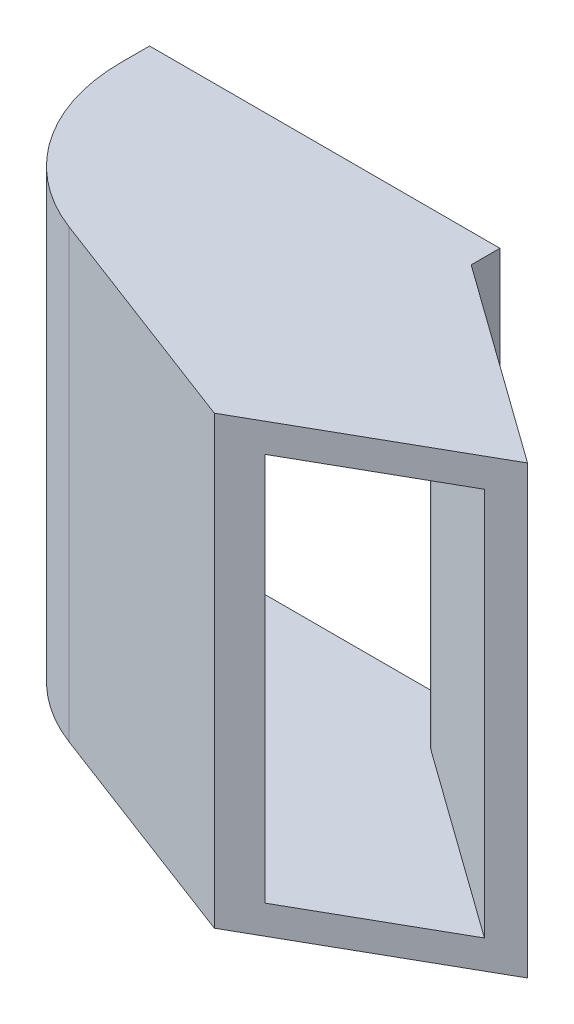
ISO-10303-21;
HEADER;
FILE_DESCRIPTION(('STEP AP214'),'2;1');
FILE_NAME('part.step','',(''),(''),'','','');
FILE_SCHEMA(('AUTOMOTIVE_DESIGN { 1 0 10303 214 1 1 1 1 }'));
ENDSEC;
DATA;
#1=APPLICATION_CONTEXT('core data for automotive mechanical design processes');
#2=APPLICATION_PROTOCOL_DEFINITION('international standard','automotive_design',2000,#1);
#3=PRODUCT_CONTEXT('',#1,'mechanical');
#4=PRODUCT('Part','Part','',(#3));
#5=PRODUCT_RELATED_PRODUCT_CATEGORY('part','',(#4));
#6=PRODUCT_DEFINITION_FORMATION('','',#4);
#7=PRODUCT_DEFINITION_CONTEXT('part definition',#1,'design');
#8=PRODUCT_DEFINITION('design','',#6,#7);
#9=PRODUCT_DEFINITION_SHAPE('','',#8);
#10=(LENGTH_UNIT() NAMED_UNIT(*) SI_UNIT(.MILLI.,.METRE.));
#11=(NAMED_UNIT(*) PLANE_ANGLE_UNIT() SI_UNIT($,.RADIAN.));
#12=(NAMED_UNIT(*) SI_UNIT($,.STERADIAN.) SOLID_ANGLE_UNIT());
#13=UNCERTAINTY_MEASURE_WITH_UNIT(LENGTH_MEASURE(1.E-05),#10,'distance_accuracy_value','');
#14=(GEOMETRIC_REPRESENTATION_CONTEXT(3) GLOBAL_UNCERTAINTY_ASSIGNED_CONTEXT((#13)) GLOBAL_UNIT_ASSIGNED_CONTEXT((#10,
#11,#12)) REPRESENTATION_CONTEXT('',''));
#15=CARTESIAN_POINT('',(0.,0.,0.));
#16=DIRECTION('',(0.,0.,1.));
#17=DIRECTION('',(1.,0.,0.));
#18=AXIS2_PLACEMENT_3D('',#15,#16,#17);
#19=CARTESIAN_POINT('',(16.8,-23.3,0.));
#20=DIRECTION('',(0.58318555545216,0.,-0.81233897352765));
#21=DIRECTION('',(-0.81233897352765,0.,-0.58318555545216));
#22=AXIS2_PLACEMENT_3D('',#19,#20,#21);
#23=PLANE('',#22);
#24=DIRECTION('',(-0.812338973527649,0.,-0.58318555545216));
#25=VECTOR('',#24,1.);
#26=CARTESIAN_POINT('',(16.8,0.,0.));
#27=LINE('',#26,#25);
#28=CARTESIAN_POINT('',(27.2341044944077,0.,7.4907387476343));
#29=VERTEX_POINT('',#28);
#30=CARTESIAN_POINT('',(16.8,0.,0.));
#31=VERTEX_POINT('',#30);
#32=EDGE_CURVE('E210',#29,#31,#27,.T.);
#33=ORIENTED_EDGE('',*,*,#32,.F.);
#34=DIRECTION('',(0.,1.,0.));
#35=VECTOR('',#34,1.);
#36=CARTESIAN_POINT('',(27.2341044944077,-23.3,7.4907387476343));
#37=LINE('',#36,#35);
#38=CARTESIAN_POINT('',(27.2341044944077,-23.3,7.4907387476343));
#39=VERTEX_POINT('',#38);
#40=EDGE_CURVE('E12',#39,#29,#37,.T.);
#41=ORIENTED_EDGE('',*,*,#40,.F.);
#42=DIRECTION('',(-0.812338973527649,0.,-0.58318555545216));
#43=VECTOR('',#42,1.);
#44=CARTESIAN_POINT('',(16.8,-23.3,0.));
#45=LINE('',#44,#43);
#46=CARTESIAN_POINT('',(16.8,-23.3,0.));
#47=VERTEX_POINT('',#46);
#48=EDGE_CURVE('E232',#39,#47,#45,.T.);
#49=ORIENTED_EDGE('',*,*,#48,.T.);
#50=DIRECTION('',(0.,1.,0.));
#51=VECTOR('',#50,1.);
#52=CARTESIAN_POINT('',(16.8,-23.3,0.));
#53=LINE('',#52,#51);
#54=EDGE_CURVE('E38',#47,#31,#53,.T.);
#55=ORIENTED_EDGE('',*,*,#54,.T.);
#56=EDGE_LOOP('',(#33,#41,#49,#55));
#57=FACE_BOUND('',#56,.T.);
#58=ADVANCED_FACE('F35',(#57),#23,.T.);
#59=CARTESIAN_POINT('',(27.2341044944077,-23.3,7.4907387476343));
#60=DIRECTION('',(0.493917611492973,0.,0.869508707867308));
#61=DIRECTION('',(0.869508707867308,0.,-0.493917611492973));
#62=AXIS2_PLACEMENT_3D('',#59,#60,#61);
#63=PLANE('',#62);
#64=DIRECTION('',(0.869508707867308,0.,-0.493917611492973));
#65=VECTOR('',#64,1.);
#66=CARTESIAN_POINT('',(18.4935547125013,-1.5,12.4557395950709));
#67=LINE('',#66,#65);
#68=CARTESIAN_POINT('',(18.4935547125013,-1.5,12.4557395950709));
#69=VERTEX_POINT('',#68);
#70=CARTESIAN_POINT('',(25.7981871136928,-1.5,8.30640036961335));
#71=VERTEX_POINT('',#70);
#72=EDGE_CURVE('E217',#69,#71,#67,.T.);
#73=ORIENTED_EDGE('',*,*,#72,.T.);
#74=DIRECTION('',(0.,1.,0.));
#75=VECTOR('',#74,1.);
#76=CARTESIAN_POINT('',(25.7981871136928,-51.9477208031166,8.30640036961335));
#77=LINE('',#76,#75);
#78=CARTESIAN_POINT('',(25.7981871136928,-21.8,8.30640036961334));
#79=VERTEX_POINT('',#78);
#80=EDGE_CURVE('E224',#79,#71,#77,.T.);
#81=ORIENTED_EDGE('',*,*,#80,.F.);
#82=DIRECTION('',(-0.869508707867308,0.,0.493917611492974));
#83=VECTOR('',#82,1.);
#84=CARTESIAN_POINT('',(18.4935547125013,-21.8,12.4557395950709));
#85=LINE('',#84,#83);
#86=CARTESIAN_POINT('',(18.4935547125013,-21.8,12.4557395950709));
#87=VERTEX_POINT('',#86);
#88=EDGE_CURVE('E204',#79,#87,#85,.T.);
#89=ORIENTED_EDGE('',*,*,#88,.T.);
#90=DIRECTION('',(0.,1.,0.));
#91=VECTOR('',#90,1.);
#92=CARTESIAN_POINT('',(18.4935547125013,-51.9477208031166,12.4557395950709));
#93=LINE('',#92,#91);
#94=EDGE_CURVE('E51',#87,#69,#93,.T.);
#95=ORIENTED_EDGE('',*,*,#94,.T.);
#96=EDGE_LOOP('',(#73,#81,#89,#95));
#97=FACE_BOUND('',#96,.T.);
#98=DIRECTION('',(0.869508707867308,0.,-0.493917611492973));
#99=VECTOR('',#98,1.);
#100=CARTESIAN_POINT('',(27.2341044944077,0.,7.4907387476343));
#101=LINE('',#100,#99);
#102=CARTESIAN_POINT('',(16.8,0.,13.41775008555));
#103=VERTEX_POINT('',#102);
#104=EDGE_CURVE('E235',#103,#29,#101,.T.);
#105=ORIENTED_EDGE('',*,*,#104,.F.);
#106=DIRECTION('',(0.,1.,0.));
#107=VECTOR('',#106,1.);
#108=CARTESIAN_POINT('',(16.8,-23.3,13.41775008555));
#109=LINE('',#108,#107);
#110=CARTESIAN_POINT('',(16.8,-23.3,13.41775008555));
#111=VERTEX_POINT('',#110);
#112=EDGE_CURVE('E43',#111,#103,#109,.T.);
#113=ORIENTED_EDGE('',*,*,#112,.F.);
#114=DIRECTION('',(0.869508707867308,0.,-0.493917611492973));
#115=VECTOR('',#114,1.);
#116=CARTESIAN_POINT('',(27.2341044944077,-23.3,7.4907387476343));
#117=LINE('',#116,#115);
#118=EDGE_CURVE('E241',#111,#39,#117,.T.);
#119=ORIENTED_EDGE('',*,*,#118,.T.);
#120=ORIENTED_EDGE('',*,*,#40,.T.);
#121=EDGE_LOOP('',(#105,#113,#119,#120));
#122=FACE_BOUND('',#121,.T.);
#123=ADVANCED_FACE('F288',(#97,#122),#63,.T.);
#124=CARTESIAN_POINT('',(4.55721744521807,-23.3,8.77510580349605));
#125=DIRECTION('',(-0.354576128918472,0.,0.935027148697401));
#126=DIRECTION('',(0.935027148697401,0.,0.354576128918472));
#127=AXIS2_PLACEMENT_3D('',#124,#125,#126);
#128=PLANE('',#127);
#129=DIRECTION('',(0.935027148697401,0.,0.354576128918472));
#130=VECTOR('',#129,1.);
#131=CARTESIAN_POINT('',(4.55721744521807,0.,8.77510580349605));
#132=LINE('',#131,#130);
#133=CARTESIAN_POINT('',(4.55721744521806,0.,8.77510580349605));
#134=VERTEX_POINT('',#133);
#135=EDGE_CURVE('E249',#134,#103,#132,.T.);
#136=ORIENTED_EDGE('',*,*,#135,.F.);
#137=DIRECTION('',(0.,1.,0.));
#138=VECTOR('',#137,1.);
#139=CARTESIAN_POINT('',(4.55721744521806,-23.3,8.77510580349605));
#140=LINE('',#139,#138);
#141=CARTESIAN_POINT('',(4.55721744521806,-23.3,8.77510580349605));
#142=VERTEX_POINT('',#141);
#143=EDGE_CURVE('E255',#142,#134,#140,.T.);
#144=ORIENTED_EDGE('',*,*,#143,.F.);
#145=DIRECTION('',(0.935027148697401,0.,0.354576128918472));
#146=VECTOR('',#145,1.);
#147=CARTESIAN_POINT('',(4.55721744521807,-23.3,8.77510580349605));
#148=LINE('',#147,#146);
#149=EDGE_CURVE('E238',#142,#111,#148,.T.);
#150=ORIENTED_EDGE('',*,*,#149,.T.);
#151=ORIENTED_EDGE('',*,*,#112,.T.);
#152=EDGE_LOOP('',(#136,#144,#150,#151));
#153=FACE_BOUND('',#152,.T.);
#154=ADVANCED_FACE('F286',(#153),#128,.T.);
#155=CARTESIAN_POINT('',(7.88486739740206,-23.3,0.));
#156=DIRECTION('',(0.,1.,0.));
#157=DIRECTION('',(0.,0.,1.));
#158=AXIS2_PLACEMENT_3D('',#155,#156,#157);
#159=CYLINDRICAL_SURFACE('',#158,9.38486739740206);
#160=CARTESIAN_POINT('',(7.88486739740206,0.,0.));
#161=DIRECTION('',(0.,1.,0.));
#162=DIRECTION('',(0.,0.,1.));
#163=AXIS2_PLACEMENT_3D('',#160,#161,#162);
#164=CIRCLE('',#163,9.38486739740206);
#165=CARTESIAN_POINT('',(-1.5,0.,0.));
#166=VERTEX_POINT('',#165);
#167=EDGE_CURVE('E246',#166,#134,#164,.T.);
#168=ORIENTED_EDGE('',*,*,#167,.F.);
#169=DIRECTION('',(0.,1.,0.));
#170=VECTOR('',#169,1.);
#171=CARTESIAN_POINT('',(-1.5,-23.3,0.));
#172=LINE('',#171,#170);
#173=CARTESIAN_POINT('',(-1.5,-23.3,0.));
#174=VERTEX_POINT('',#173);
#175=EDGE_CURVE('E256',#174,#166,#172,.T.);
#176=ORIENTED_EDGE('',*,*,#175,.F.);
#177=CARTESIAN_POINT('',(7.88486739740206,-23.3,0.));
#178=DIRECTION('',(0.,1.,0.));
#179=DIRECTION('',(0.,0.,1.));
#180=AXIS2_PLACEMENT_3D('',#177,#178,#179);
#181=CIRCLE('',#180,9.38486739740206);
#182=EDGE_CURVE('E234',#174,#142,#181,.T.);
#183=ORIENTED_EDGE('',*,*,#182,.T.);
#184=ORIENTED_EDGE('',*,*,#143,.T.);
#185=EDGE_LOOP('',(#168,#176,#183,#184));
#186=FACE_BOUND('',#185,.T.);
#187=ADVANCED_FACE('F283',(#186),#159,.T.);
#188=CARTESIAN_POINT('',(7.88486739740206,-23.3,0.));
#189=DIRECTION('',(0.,1.,0.));
#190=DIRECTION('',(0.,0.,1.));
#191=AXIS2_PLACEMENT_3D('',#188,#189,#190);
#192=PLANE('',#191);
#193=ORIENTED_EDGE('',*,*,#48,.F.);
#194=ORIENTED_EDGE('',*,*,#118,.F.);
#195=ORIENTED_EDGE('',*,*,#149,.F.);
#196=ORIENTED_EDGE('',*,*,#182,.F.);
#197=DIRECTION('',(0.,0.,1.));
#198=VECTOR('',#197,1.);
#199=CARTESIAN_POINT('',(-1.5,-23.3,-1.5));
#200=LINE('',#199,#198);
#201=CARTESIAN_POINT('',(-1.5,-23.3,-1.5));
#202=VERTEX_POINT('',#201);
#203=EDGE_CURVE('E192',#202,#174,#200,.T.);
#204=ORIENTED_EDGE('',*,*,#203,.F.);
#205=DIRECTION('',(-1.,0.,0.));
#206=VECTOR('',#205,1.);
#207=CARTESIAN_POINT('',(16.8,-23.3,-1.5));
#208=LINE('',#207,#206);
#209=CARTESIAN_POINT('',(16.8,-23.3,-1.5));
#210=VERTEX_POINT('',#209);
#211=EDGE_CURVE('E180',#210,#202,#208,.T.);
#212=ORIENTED_EDGE('',*,*,#211,.F.);
#213=DIRECTION('',(0.,0.,1.));
#214=VECTOR('',#213,1.);
#215=CARTESIAN_POINT('',(16.8,-23.3,-1.5));
#216=LINE('',#215,#214);
#217=EDGE_CURVE('E195',#210,#47,#216,.T.);
#218=ORIENTED_EDGE('',*,*,#217,.T.);
#219=EDGE_LOOP('',(#193,#194,#195,#196,#204,#212,#218));
#220=FACE_BOUND('',#219,.T.);
#221=ADVANCED_FACE('F279',(#220),#192,.F.);
#222=CARTESIAN_POINT('',(7.88486739740206,0.,0.));
#223=DIRECTION('',(0.,1.,0.));
#224=DIRECTION('',(0.,0.,1.));
#225=AXIS2_PLACEMENT_3D('',#222,#223,#224);
#226=PLANE('',#225);
#227=ORIENTED_EDGE('',*,*,#32,.T.);
#228=DIRECTION('',(0.,0.,1.));
#229=VECTOR('',#228,1.);
#230=CARTESIAN_POINT('',(16.8,0.,-1.5));
#231=LINE('',#230,#229);
#232=CARTESIAN_POINT('',(16.8,0.,-1.5));
#233=VERTEX_POINT('',#232);
#234=EDGE_CURVE('E186',#233,#31,#231,.T.);
#235=ORIENTED_EDGE('',*,*,#234,.F.);
#236=DIRECTION('',(1.,0.,0.));
#237=VECTOR('',#236,1.);
#238=CARTESIAN_POINT('',(16.8,0.,-1.5));
#239=LINE('',#238,#237);
#240=CARTESIAN_POINT('',(-1.5,0.,-1.5));
#241=VERTEX_POINT('',#240);
#242=EDGE_CURVE('E184',#241,#233,#239,.T.);
#243=ORIENTED_EDGE('',*,*,#242,.F.);
#244=DIRECTION('',(0.,0.,1.));
#245=VECTOR('',#244,1.);
#246=CARTESIAN_POINT('',(-1.5,0.,-1.5));
#247=LINE('',#246,#245);
#248=EDGE_CURVE('E189',#241,#166,#247,.T.);
#249=ORIENTED_EDGE('',*,*,#248,.T.);
#250=ORIENTED_EDGE('',*,*,#167,.T.);
#251=ORIENTED_EDGE('',*,*,#135,.T.);
#252=ORIENTED_EDGE('',*,*,#104,.T.);
#253=EDGE_LOOP('',(#227,#235,#243,#249,#250,#251,#252));
#254=FACE_BOUND('',#253,.T.);
#255=ADVANCED_FACE('F268',(#254),#226,.T.);
#256=CARTESIAN_POINT('',(16.8,-51.9477208031166,0.));
#257=DIRECTION('',(0.,1.,0.));
#258=DIRECTION('',(0.,0.,1.));
#259=AXIS2_PLACEMENT_3D('',#256,#257,#258);
#260=CYLINDRICAL_SURFACE('',#259,1.5);
#261=CARTESIAN_POINT('',(16.8,-21.8,0.));
#262=DIRECTION('',(0.,1.,0.));
#263=DIRECTION('',(0.,0.,1.));
#264=AXIS2_PLACEMENT_3D('',#261,#262,#263);
#265=CIRCLE('',#264,1.5);
#266=CARTESIAN_POINT('',(15.3,-21.8,0.));
#267=VERTEX_POINT('',#266);
#268=CARTESIAN_POINT('',(15.9252216668218,-21.8,1.21850846029147));
#269=VERTEX_POINT('',#268);
#270=EDGE_CURVE('E160',#267,#269,#265,.T.);
#271=ORIENTED_EDGE('',*,*,#270,.T.);
#272=DIRECTION('',(0.,1.,0.));
#273=VECTOR('',#272,1.);
#274=CARTESIAN_POINT('',(15.9252216668218,-51.9477208031166,1.21850846029147));
#275=LINE('',#274,#273);
#276=CARTESIAN_POINT('',(15.9252216668218,-1.5,1.21850846029147));
#277=VERTEX_POINT('',#276);
#278=EDGE_CURVE('E202',#269,#277,#275,.T.);
#279=ORIENTED_EDGE('',*,*,#278,.T.);
#280=CARTESIAN_POINT('',(16.8,-1.5,0.));
#281=DIRECTION('',(0.,-1.,0.));
#282=DIRECTION('',(0.,0.,1.));
#283=AXIS2_PLACEMENT_3D('',#280,#281,#282);
#284=CIRCLE('',#283,1.5);
#285=CARTESIAN_POINT('',(15.3,-1.5,0.));
#286=VERTEX_POINT('',#285);
#287=EDGE_CURVE('E198',#277,#286,#284,.T.);
#288=ORIENTED_EDGE('',*,*,#287,.T.);
#289=DIRECTION('',(0.,1.,0.));
#290=VECTOR('',#289,1.);
#291=CARTESIAN_POINT('',(15.3,-51.9477208031166,0.));
#292=LINE('',#291,#290);
#293=EDGE_CURVE('E59',#267,#286,#292,.T.);
#294=ORIENTED_EDGE('',*,*,#293,.F.);
#295=EDGE_LOOP('',(#271,#279,#288,#294));
#296=FACE_BOUND('',#295,.T.);
#297=ADVANCED_FACE('F306',(#296),#260,.T.);
#298=CARTESIAN_POINT('',(25.7981871136928,-51.9477208031166,8.30640036961335));
#299=DIRECTION('',(0.58318555545216,0.,-0.81233897352765));
#300=DIRECTION('',(-0.81233897352765,0.,-0.58318555545216));
#301=AXIS2_PLACEMENT_3D('',#298,#299,#300);
#302=PLANE('',#301);
#303=DIRECTION('',(0.81233897352765,0.,0.58318555545216));
#304=VECTOR('',#303,1.);
#305=CARTESIAN_POINT('',(25.7981871136928,-21.8,8.30640036961335));
#306=LINE('',#305,#304);
#307=EDGE_CURVE('E207',#269,#79,#306,.T.);
#308=ORIENTED_EDGE('',*,*,#307,.T.);
#309=ORIENTED_EDGE('',*,*,#80,.T.);
#310=DIRECTION('',(-0.81233897352765,0.,-0.58318555545216));
#311=VECTOR('',#310,1.);
#312=CARTESIAN_POINT('',(25.7981871136928,-1.5,8.30640036961335));
#313=LINE('',#312,#311);
#314=EDGE_CURVE('E220',#71,#277,#313,.T.);
#315=ORIENTED_EDGE('',*,*,#314,.T.);
#316=ORIENTED_EDGE('',*,*,#278,.F.);
#317=EDGE_LOOP('',(#308,#309,#315,#316));
#318=FACE_BOUND('',#317,.T.);
#319=ADVANCED_FACE('F310',(#318),#302,.F.);
#320=CARTESIAN_POINT('',(5.08908163859578,-51.9477208031166,7.37256508044994));
#321=DIRECTION('',(-0.354576128918472,0.,0.935027148697401));
#322=DIRECTION('',(0.935027148697401,0.,0.354576128918472));
#323=AXIS2_PLACEMENT_3D('',#320,#321,#322);
#324=PLANE('',#323);
#325=DIRECTION('',(-0.935027148697401,0.,-0.354576128918472));
#326=VECTOR('',#325,1.);
#327=CARTESIAN_POINT('',(5.08908163859578,-21.8,7.37256508044994));
#328=LINE('',#327,#326);
#329=CARTESIAN_POINT('',(5.08908163859577,-21.8,7.37256508044994));
#330=VERTEX_POINT('',#329);
#331=EDGE_CURVE('E201',#87,#330,#328,.T.);
#332=ORIENTED_EDGE('',*,*,#331,.T.);
#333=DIRECTION('',(0.,1.,0.));
#334=VECTOR('',#333,1.);
#335=CARTESIAN_POINT('',(5.08908163859577,-51.9477208031166,7.37256508044994));
#336=LINE('',#335,#334);
#337=CARTESIAN_POINT('',(5.08908163859577,-1.5,7.37256508044994));
#338=VERTEX_POINT('',#337);
#339=EDGE_CURVE('E227',#330,#338,#336,.T.);
#340=ORIENTED_EDGE('',*,*,#339,.T.);
#341=DIRECTION('',(0.935027148697401,0.,0.354576128918472));
#342=VECTOR('',#341,1.);
#343=CARTESIAN_POINT('',(5.08908163859578,-1.5,7.37256508044994));
#344=LINE('',#343,#342);
#345=EDGE_CURVE('E215',#338,#69,#344,.T.);
#346=ORIENTED_EDGE('',*,*,#345,.T.);
#347=ORIENTED_EDGE('',*,*,#94,.F.);
#348=EDGE_LOOP('',(#332,#340,#346,#347));
#349=FACE_BOUND('',#348,.T.);
#350=ADVANCED_FACE('F315',(#349),#324,.F.);
#351=CARTESIAN_POINT('',(7.88486739740206,-51.9477208031166,0.));
#352=DIRECTION('',(0.,1.,0.));
#353=DIRECTION('',(0.,0.,1.));
#354=AXIS2_PLACEMENT_3D('',#351,#352,#353);
#355=CYLINDRICAL_SURFACE('',#354,7.88486739740206);
#356=CARTESIAN_POINT('',(7.88486739740206,-21.8,0.));
#357=DIRECTION('',(0.,1.,0.));
#358=DIRECTION('',(0.,0.,1.));
#359=AXIS2_PLACEMENT_3D('',#356,#357,#358);
#360=CIRCLE('',#359,7.88486739740206);
#361=CARTESIAN_POINT('',(0.,-21.8,0.));
#362=VERTEX_POINT('',#361);
#363=EDGE_CURVE('E199',#330,#362,#360,.F.);
#364=ORIENTED_EDGE('',*,*,#363,.T.);
#365=DIRECTION('',(0.,1.,0.));
#366=VECTOR('',#365,1.);
#367=CARTESIAN_POINT('',(0.,-51.9477208031166,0.));
#368=LINE('',#367,#366);
#369=CARTESIAN_POINT('',(0.,-1.5,0.));
#370=VERTEX_POINT('',#369);
#371=EDGE_CURVE('E229',#362,#370,#368,.T.);
#372=ORIENTED_EDGE('',*,*,#371,.T.);
#373=CARTESIAN_POINT('',(7.88486739740206,-1.5,0.));
#374=DIRECTION('',(0.,1.,0.));
#375=DIRECTION('',(0.,0.,1.));
#376=AXIS2_PLACEMENT_3D('',#373,#374,#375);
#377=CIRCLE('',#376,7.88486739740206);
#378=EDGE_CURVE('E212',#370,#338,#377,.T.);
#379=ORIENTED_EDGE('',*,*,#378,.T.);
#380=ORIENTED_EDGE('',*,*,#339,.F.);
#381=EDGE_LOOP('',(#364,#372,#379,#380));
#382=FACE_BOUND('',#381,.T.);
#383=ADVANCED_FACE('F311',(#382),#355,.F.);
#384=CARTESIAN_POINT('',(16.8,-1.5,0.));
#385=DIRECTION('',(0.,1.,0.));
#386=DIRECTION('',(0.,0.,1.));
#387=AXIS2_PLACEMENT_3D('',#384,#385,#386);
#388=PLANE('',#387);
#389=ORIENTED_EDGE('',*,*,#287,.F.);
#390=ORIENTED_EDGE('',*,*,#314,.F.);
#391=ORIENTED_EDGE('',*,*,#72,.F.);
#392=ORIENTED_EDGE('',*,*,#345,.F.);
#393=ORIENTED_EDGE('',*,*,#378,.F.);
#394=DIRECTION('',(0.,0.,1.));
#395=VECTOR('',#394,1.);
#396=CARTESIAN_POINT('',(0.,-1.5,-1.5));
#397=LINE('',#396,#395);
#398=CARTESIAN_POINT('',(0.,-1.5,-1.5));
#399=VERTEX_POINT('',#398);
#400=EDGE_CURVE('E174',#399,#370,#397,.T.);
#401=ORIENTED_EDGE('',*,*,#400,.F.);
#402=DIRECTION('',(1.,0.,0.));
#403=VECTOR('',#402,1.);
#404=CARTESIAN_POINT('',(15.3,-1.5,-1.5));
#405=LINE('',#404,#403);
#406=CARTESIAN_POINT('',(15.3,-1.5,-1.5));
#407=VERTEX_POINT('',#406);
#408=EDGE_CURVE('E169',#399,#407,#405,.T.);
#409=ORIENTED_EDGE('',*,*,#408,.T.);
#410=DIRECTION('',(0.,0.,1.));
#411=VECTOR('',#410,1.);
#412=CARTESIAN_POINT('',(15.3,-1.5,-1.5));
#413=LINE('',#412,#411);
#414=EDGE_CURVE('E149',#407,#286,#413,.T.);
#415=ORIENTED_EDGE('',*,*,#414,.T.);
#416=EDGE_LOOP('',(#389,#390,#391,#392,#393,#401,#409,#415));
#417=FACE_BOUND('',#416,.T.);
#418=ADVANCED_FACE('F314',(#417),#388,.F.);
#419=CARTESIAN_POINT('',(7.88486739740206,-21.8,0.));
#420=DIRECTION('',(0.,1.,0.));
#421=DIRECTION('',(0.,0.,1.));
#422=AXIS2_PLACEMENT_3D('',#419,#420,#421);
#423=PLANE('',#422);
#424=ORIENTED_EDGE('',*,*,#270,.F.);
#425=DIRECTION('',(0.,0.,1.));
#426=VECTOR('',#425,1.);
#427=CARTESIAN_POINT('',(15.3,-21.8,-1.5));
#428=LINE('',#427,#426);
#429=CARTESIAN_POINT('',(15.3,-21.8,-1.5));
#430=VERTEX_POINT('',#429);
#431=EDGE_CURVE('E147',#430,#267,#428,.T.);
#432=ORIENTED_EDGE('',*,*,#431,.F.);
#433=DIRECTION('',(-1.,0.,0.));
#434=VECTOR('',#433,1.);
#435=CARTESIAN_POINT('',(15.3,-21.8,-1.5));
#436=LINE('',#435,#434);
#437=CARTESIAN_POINT('',(0.,-21.8,-1.5));
#438=VERTEX_POINT('',#437);
#439=EDGE_CURVE('E153',#430,#438,#436,.T.);
#440=ORIENTED_EDGE('',*,*,#439,.T.);
#441=DIRECTION('',(0.,0.,1.));
#442=VECTOR('',#441,1.);
#443=CARTESIAN_POINT('',(0.,-21.8,-1.5));
#444=LINE('',#443,#442);
#445=EDGE_CURVE('E162',#438,#362,#444,.T.);
#446=ORIENTED_EDGE('',*,*,#445,.T.);
#447=ORIENTED_EDGE('',*,*,#363,.F.);
#448=ORIENTED_EDGE('',*,*,#331,.F.);
#449=ORIENTED_EDGE('',*,*,#88,.F.);
#450=ORIENTED_EDGE('',*,*,#307,.F.);
#451=EDGE_LOOP('',(#424,#432,#440,#446,#447,#448,#449,#450));
#452=FACE_BOUND('',#451,.T.);
#453=ADVANCED_FACE('F156',(#452),#423,.T.);
#454=CARTESIAN_POINT('',(0.,0.,-1.5));
#455=DIRECTION('',(0.,0.,-1.));
#456=DIRECTION('',(-1.,0.,0.));
#457=AXIS2_PLACEMENT_3D('',#454,#455,#456);
#458=PLANE('',#457);
#459=DIRECTION('',(0.,-1.,0.));
#460=VECTOR('',#459,1.);
#461=CARTESIAN_POINT('',(16.8,0.,-1.5));
#462=LINE('',#461,#460);
#463=EDGE_CURVE('E161',#233,#210,#462,.T.);
#464=ORIENTED_EDGE('',*,*,#463,.T.);
#465=ORIENTED_EDGE('',*,*,#211,.T.);
#466=DIRECTION('',(0.,1.,0.));
#467=VECTOR('',#466,1.);
#468=CARTESIAN_POINT('',(-1.5,0.,-1.5));
#469=LINE('',#468,#467);
#470=EDGE_CURVE('E182',#202,#241,#469,.T.);
#471=ORIENTED_EDGE('',*,*,#470,.T.);
#472=ORIENTED_EDGE('',*,*,#242,.T.);
#473=EDGE_LOOP('',(#464,#465,#471,#472));
#474=FACE_BOUND('',#473,.T.);
#475=ORIENTED_EDGE('',*,*,#439,.F.);
#476=DIRECTION('',(0.,-1.,0.));
#477=VECTOR('',#476,1.);
#478=CARTESIAN_POINT('',(15.3,-1.5,-1.5));
#479=LINE('',#478,#477);
#480=EDGE_CURVE('E144',#407,#430,#479,.T.);
#481=ORIENTED_EDGE('',*,*,#480,.F.);
#482=ORIENTED_EDGE('',*,*,#408,.F.);
#483=DIRECTION('',(0.,1.,0.));
#484=VECTOR('',#483,1.);
#485=CARTESIAN_POINT('',(0.,-1.5,-1.5));
#486=LINE('',#485,#484);
#487=EDGE_CURVE('E167',#438,#399,#486,.T.);
#488=ORIENTED_EDGE('',*,*,#487,.F.);
#489=EDGE_LOOP('',(#475,#481,#482,#488));
#490=FACE_BOUND('',#489,.T.);
#491=ADVANCED_FACE('F165',(#474,#490),#458,.T.);
#492=CARTESIAN_POINT('',(16.8,0.,-1.5));
#493=DIRECTION('',(-1.,0.,0.));
#494=DIRECTION('',(0.,0.,1.));
#495=AXIS2_PLACEMENT_3D('',#492,#493,#494);
#496=PLANE('',#495);
#497=ORIENTED_EDGE('',*,*,#54,.F.);
#498=ORIENTED_EDGE('',*,*,#217,.F.);
#499=ORIENTED_EDGE('',*,*,#463,.F.);
#500=ORIENTED_EDGE('',*,*,#234,.T.);
#501=EDGE_LOOP('',(#497,#498,#499,#500));
#502=FACE_BOUND('',#501,.T.);
#503=ADVANCED_FACE('F272',(#502),#496,.F.);
#504=CARTESIAN_POINT('',(-1.5,0.,-1.5));
#505=DIRECTION('',(1.,0.,0.));
#506=DIRECTION('',(0.,0.,-1.));
#507=AXIS2_PLACEMENT_3D('',#504,#505,#506);
#508=PLANE('',#507);
#509=ORIENTED_EDGE('',*,*,#175,.T.);
#510=ORIENTED_EDGE('',*,*,#248,.F.);
#511=ORIENTED_EDGE('',*,*,#470,.F.);
#512=ORIENTED_EDGE('',*,*,#203,.T.);
#513=EDGE_LOOP('',(#509,#510,#511,#512));
#514=FACE_BOUND('',#513,.T.);
#515=ADVANCED_FACE('F276',(#514),#508,.F.);
#516=CARTESIAN_POINT('',(15.3,-1.5,-1.5));
#517=DIRECTION('',(-1.,0.,0.));
#518=DIRECTION('',(0.,0.,1.));
#519=AXIS2_PLACEMENT_3D('',#516,#517,#518);
#520=PLANE('',#519);
#521=ORIENTED_EDGE('',*,*,#293,.T.);
#522=ORIENTED_EDGE('',*,*,#414,.F.);
#523=ORIENTED_EDGE('',*,*,#480,.T.);
#524=ORIENTED_EDGE('',*,*,#431,.T.);
#525=EDGE_LOOP('',(#521,#522,#523,#524));
#526=FACE_BOUND('',#525,.T.);
#527=ADVANCED_FACE('F146',(#526),#520,.T.);
#528=CARTESIAN_POINT('',(0.,-1.5,-1.5));
#529=DIRECTION('',(1.,0.,0.));
#530=DIRECTION('',(0.,0.,-1.));
#531=AXIS2_PLACEMENT_3D('',#528,#529,#530);
#532=PLANE('',#531);
#533=ORIENTED_EDGE('',*,*,#371,.F.);
#534=ORIENTED_EDGE('',*,*,#445,.F.);
#535=ORIENTED_EDGE('',*,*,#487,.T.);
#536=ORIENTED_EDGE('',*,*,#400,.T.);
#537=EDGE_LOOP('',(#533,#534,#535,#536));
#538=FACE_BOUND('',#537,.T.);
#539=ADVANCED_FACE('F335',(#538),#532,.T.);
#540=CLOSED_SHELL('',(#58,#123,#154,#187,#221,#255,#297,#319,#350,#383,#418,#453,#491,#503,#515,
#527,#539));
#541=MANIFOLD_SOLID_BREP('B2',#540);
#542=ADVANCED_BREP_SHAPE_REPRESENTATION('',(#18,#541),#14);
#543=SHAPE_DEFINITION_REPRESENTATION(#9,#542);
ENDSEC;
END-ISO-10303-21;
